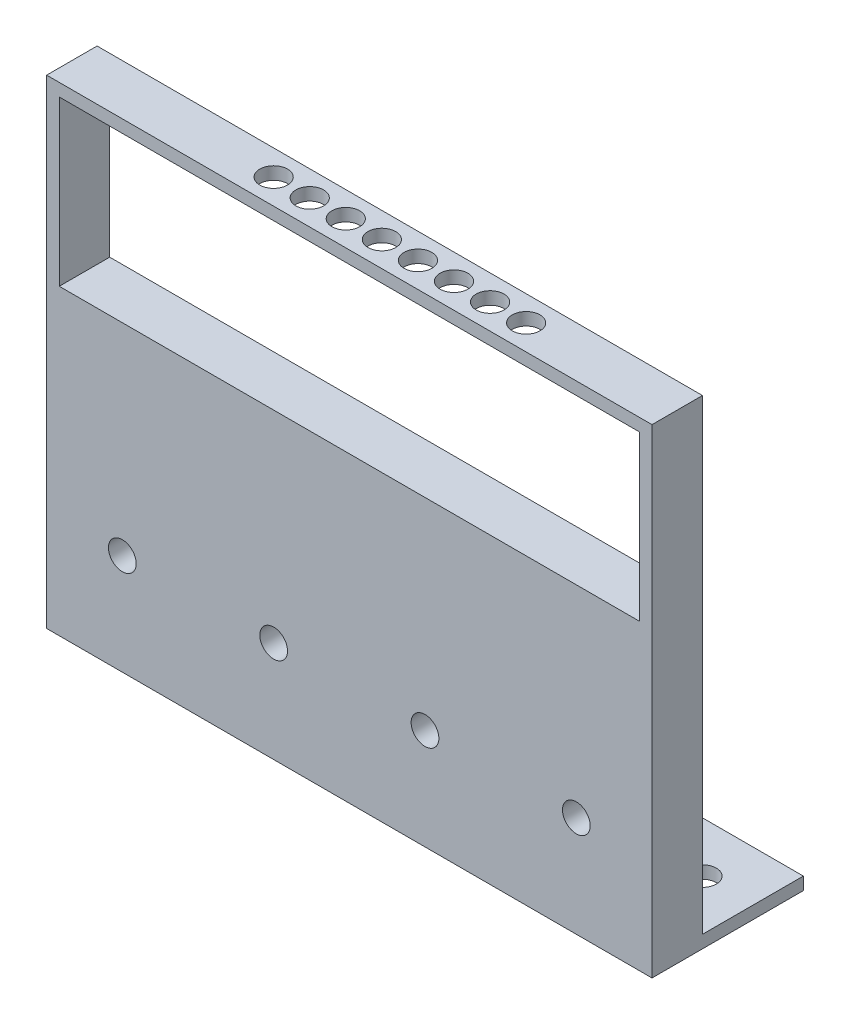
ISO-10303-21;
HEADER;
FILE_DESCRIPTION(('STEP AP214'),'2;1');
FILE_NAME('part.step','',(''),(''),'','','');
FILE_SCHEMA(('AUTOMOTIVE_DESIGN { 1 0 10303 214 1 1 1 1 }'));
ENDSEC;
DATA;
#1=APPLICATION_CONTEXT('core data for automotive mechanical design processes');
#2=APPLICATION_PROTOCOL_DEFINITION('international standard','automotive_design',2000,#1);
#3=PRODUCT_CONTEXT('',#1,'mechanical');
#4=PRODUCT('Part','Part','',(#3));
#5=PRODUCT_RELATED_PRODUCT_CATEGORY('part','',(#4));
#6=PRODUCT_DEFINITION_FORMATION('','',#4);
#7=PRODUCT_DEFINITION_CONTEXT('part definition',#1,'design');
#8=PRODUCT_DEFINITION('design','',#6,#7);
#9=PRODUCT_DEFINITION_SHAPE('','',#8);
#10=(LENGTH_UNIT() NAMED_UNIT(*) SI_UNIT(.MILLI.,.METRE.));
#11=(NAMED_UNIT(*) PLANE_ANGLE_UNIT() SI_UNIT($,.RADIAN.));
#12=(NAMED_UNIT(*) SI_UNIT($,.STERADIAN.) SOLID_ANGLE_UNIT());
#13=UNCERTAINTY_MEASURE_WITH_UNIT(LENGTH_MEASURE(1.E-05),#10,'distance_accuracy_value','');
#14=(GEOMETRIC_REPRESENTATION_CONTEXT(3) GLOBAL_UNCERTAINTY_ASSIGNED_CONTEXT((#13)) GLOBAL_UNIT_ASSIGNED_CONTEXT((#10,
#11,#12)) REPRESENTATION_CONTEXT('',''));
#15=CARTESIAN_POINT('',(0.,0.,0.));
#16=DIRECTION('',(0.,0.,1.));
#17=DIRECTION('',(1.,0.,0.));
#18=AXIS2_PLACEMENT_3D('',#15,#16,#17);
#19=CARTESIAN_POINT('',(-76.2,76.2,-6.35));
#20=DIRECTION('',(0.,0.,1.));
#21=DIRECTION('',(1.,0.,0.));
#22=AXIS2_PLACEMENT_3D('',#19,#20,#21);
#23=PLANE('',#22);
#24=CARTESIAN_POINT('',(-19.05,25.4,-6.35));
#25=DIRECTION('',(0.,0.,1.));
#26=DIRECTION('',(1.,0.,0.));
#27=AXIS2_PLACEMENT_3D('',#24,#25,#26);
#28=CIRCLE('',#27,3.49250000000001);
#29=CARTESIAN_POINT('',(-15.5575,25.4,-6.35));
#30=VERTEX_POINT('',#29);
#31=EDGE_CURVE('E308',#30,#30,#28,.T.);
#32=ORIENTED_EDGE('',*,*,#31,.T.);
#33=EDGE_LOOP('',(#32));
#34=FACE_BOUND('',#33,.T.);
#35=CARTESIAN_POINT('',(19.05,25.4,-6.35));
#36=DIRECTION('',(0.,0.,1.));
#37=DIRECTION('',(1.,0.,0.));
#38=AXIS2_PLACEMENT_3D('',#35,#36,#37);
#39=CIRCLE('',#38,3.49250000000001);
#40=CARTESIAN_POINT('',(22.5425,25.4,-6.35));
#41=VERTEX_POINT('',#40);
#42=EDGE_CURVE('E311',#41,#41,#39,.T.);
#43=ORIENTED_EDGE('',*,*,#42,.T.);
#44=EDGE_LOOP('',(#43));
#45=FACE_BOUND('',#44,.T.);
#46=CARTESIAN_POINT('',(57.15,25.4,-6.35));
#47=DIRECTION('',(0.,0.,1.));
#48=DIRECTION('',(1.,0.,0.));
#49=AXIS2_PLACEMENT_3D('',#46,#47,#48);
#50=CIRCLE('',#49,3.49250000000001);
#51=CARTESIAN_POINT('',(60.6425,25.4,-6.35));
#52=VERTEX_POINT('',#51);
#53=EDGE_CURVE('E314',#52,#52,#50,.T.);
#54=ORIENTED_EDGE('',*,*,#53,.T.);
#55=EDGE_LOOP('',(#54));
#56=FACE_BOUND('',#55,.T.);
#57=CARTESIAN_POINT('',(-57.15,25.4,-6.35));
#58=DIRECTION('',(0.,0.,1.));
#59=DIRECTION('',(1.,0.,0.));
#60=AXIS2_PLACEMENT_3D('',#57,#58,#59);
#61=CIRCLE('',#60,3.49250000000001);
#62=CARTESIAN_POINT('',(-53.6575,25.4,-6.35));
#63=VERTEX_POINT('',#62);
#64=EDGE_CURVE('E265',#63,#63,#61,.T.);
#65=ORIENTED_EDGE('',*,*,#64,.T.);
#66=EDGE_LOOP('',(#65));
#67=FACE_BOUND('',#66,.T.);
#68=DIRECTION('',(-1.,0.,0.));
#69=VECTOR('',#68,1.);
#70=CARTESIAN_POINT('',(-76.2,76.2,-6.35));
#71=LINE('',#70,#69);
#72=CARTESIAN_POINT('',(73.025,76.2,-6.34999999999999));
#73=VERTEX_POINT('',#72);
#74=CARTESIAN_POINT('',(-73.025,76.2,-6.35));
#75=VERTEX_POINT('',#74);
#76=EDGE_CURVE('E212',#73,#75,#71,.T.);
#77=ORIENTED_EDGE('',*,*,#76,.F.);
#78=DIRECTION('',(0.,1.,0.));
#79=VECTOR('',#78,1.);
#80=CARTESIAN_POINT('',(73.025,76.2,-6.34999999999999));
#81=LINE('',#80,#79);
#82=CARTESIAN_POINT('',(73.025,117.475,-6.34999999999999));
#83=VERTEX_POINT('',#82);
#84=EDGE_CURVE('E253',#73,#83,#81,.T.);
#85=ORIENTED_EDGE('',*,*,#84,.T.);
#86=DIRECTION('',(-1.,0.,0.));
#87=VECTOR('',#86,1.);
#88=CARTESIAN_POINT('',(73.025,117.475,-6.34999999999999));
#89=LINE('',#88,#87);
#90=CARTESIAN_POINT('',(-73.025,117.475,-6.34999999999999));
#91=VERTEX_POINT('',#90);
#92=EDGE_CURVE('E147',#83,#91,#89,.T.);
#93=ORIENTED_EDGE('',*,*,#92,.T.);
#94=DIRECTION('',(0.,-1.,0.));
#95=VECTOR('',#94,1.);
#96=CARTESIAN_POINT('',(-73.025,117.475,-6.34999999999999));
#97=LINE('',#96,#95);
#98=EDGE_CURVE('E115',#91,#75,#97,.T.);
#99=ORIENTED_EDGE('',*,*,#98,.T.);
#100=EDGE_LOOP('',(#77,#85,#93,#99));
#101=FACE_BOUND('',#100,.T.);
#102=DIRECTION('',(1.,0.,0.));
#103=VECTOR('',#102,1.);
#104=CARTESIAN_POINT('',(-76.2,3.175,-6.35));
#105=LINE('',#104,#103);
#106=CARTESIAN_POINT('',(-76.2,3.17500000000003,-6.35));
#107=VERTEX_POINT('',#106);
#108=CARTESIAN_POINT('',(76.2,3.175,-6.35));
#109=VERTEX_POINT('',#108);
#110=EDGE_CURVE('E196',#107,#109,#105,.T.);
#111=ORIENTED_EDGE('',*,*,#110,.F.);
#112=DIRECTION('',(0.,-1.,0.));
#113=VECTOR('',#112,1.);
#114=CARTESIAN_POINT('',(-76.2,76.2,-6.35));
#115=LINE('',#114,#113);
#116=CARTESIAN_POINT('',(-76.2,120.65,-6.34999999999999));
#117=VERTEX_POINT('',#116);
#118=EDGE_CURVE('E41',#117,#107,#115,.T.);
#119=ORIENTED_EDGE('',*,*,#118,.F.);
#120=DIRECTION('',(1.,0.,0.));
#121=VECTOR('',#120,1.);
#122=CARTESIAN_POINT('',(-76.2,120.65,-6.34999999999999));
#123=LINE('',#122,#121);
#124=CARTESIAN_POINT('',(76.2,120.65,-6.34999999999999));
#125=VERTEX_POINT('',#124);
#126=EDGE_CURVE('E137',#117,#125,#123,.T.);
#127=ORIENTED_EDGE('',*,*,#126,.T.);
#128=DIRECTION('',(0.,-1.,0.));
#129=VECTOR('',#128,1.);
#130=CARTESIAN_POINT('',(76.2,76.2,-6.35));
#131=LINE('',#130,#129);
#132=EDGE_CURVE('E11',#125,#109,#131,.T.);
#133=ORIENTED_EDGE('',*,*,#132,.T.);
#134=EDGE_LOOP('',(#111,#119,#127,#133));
#135=FACE_BOUND('',#134,.T.);
#136=ADVANCED_FACE('F33',(#34,#45,#56,#67,#101,#135),#23,.F.);
#137=CARTESIAN_POINT('',(76.2,76.2,6.35));
#138=DIRECTION('',(-1.,0.,0.));
#139=DIRECTION('',(0.,0.,1.));
#140=AXIS2_PLACEMENT_3D('',#137,#138,#139);
#141=PLANE('',#140);
#142=DIRECTION('',(0.,0.,-1.));
#143=VECTOR('',#142,1.);
#144=CARTESIAN_POINT('',(76.2,0.,6.35));
#145=LINE('',#144,#143);
#146=CARTESIAN_POINT('',(76.2,0.,6.35));
#147=VERTEX_POINT('',#146);
#148=CARTESIAN_POINT('',(76.2,0.,-31.75));
#149=VERTEX_POINT('',#148);
#150=EDGE_CURVE('E211',#147,#149,#145,.T.);
#151=ORIENTED_EDGE('',*,*,#150,.T.);
#152=DIRECTION('',(0.,-1.,0.));
#153=VECTOR('',#152,1.);
#154=CARTESIAN_POINT('',(76.2,3.175,-31.75));
#155=LINE('',#154,#153);
#156=CARTESIAN_POINT('',(76.2,3.175,-31.75));
#157=VERTEX_POINT('',#156);
#158=EDGE_CURVE('E208',#157,#149,#155,.T.);
#159=ORIENTED_EDGE('',*,*,#158,.F.);
#160=DIRECTION('',(0.,0.,-1.));
#161=VECTOR('',#160,1.);
#162=CARTESIAN_POINT('',(76.2,3.175,-6.35));
#163=LINE('',#162,#161);
#164=EDGE_CURVE('E199',#109,#157,#163,.T.);
#165=ORIENTED_EDGE('',*,*,#164,.F.);
#166=ORIENTED_EDGE('',*,*,#132,.F.);
#167=DIRECTION('',(0.,0.,1.));
#168=VECTOR('',#167,1.);
#169=CARTESIAN_POINT('',(76.2,120.65,-165.1));
#170=LINE('',#169,#168);
#171=CARTESIAN_POINT('',(76.2,120.65,6.35));
#172=VERTEX_POINT('',#171);
#173=EDGE_CURVE('E148',#125,#172,#170,.T.);
#174=ORIENTED_EDGE('',*,*,#173,.T.);
#175=DIRECTION('',(0.,-1.,0.));
#176=VECTOR('',#175,1.);
#177=CARTESIAN_POINT('',(76.2,76.2,6.35));
#178=LINE('',#177,#176);
#179=EDGE_CURVE('E216',#172,#147,#178,.T.);
#180=ORIENTED_EDGE('',*,*,#179,.T.);
#181=EDGE_LOOP('',(#151,#159,#165,#166,#174,#180));
#182=FACE_BOUND('',#181,.T.);
#183=ADVANCED_FACE('F35',(#182),#141,.F.);
#184=CARTESIAN_POINT('',(-76.2,76.2,6.35));
#185=DIRECTION('',(1.,0.,0.));
#186=DIRECTION('',(0.,0.,-1.));
#187=AXIS2_PLACEMENT_3D('',#184,#185,#186);
#188=PLANE('',#187);
#189=DIRECTION('',(0.,0.,1.));
#190=VECTOR('',#189,1.);
#191=CARTESIAN_POINT('',(-76.2,0.,6.35));
#192=LINE('',#191,#190);
#193=CARTESIAN_POINT('',(-76.2,0.,-31.75));
#194=VERTEX_POINT('',#193);
#195=CARTESIAN_POINT('',(-76.2,0.,6.35));
#196=VERTEX_POINT('',#195);
#197=EDGE_CURVE('E218',#194,#196,#192,.T.);
#198=ORIENTED_EDGE('',*,*,#197,.T.);
#199=DIRECTION('',(0.,-1.,0.));
#200=VECTOR('',#199,1.);
#201=CARTESIAN_POINT('',(-76.2,76.2,6.35));
#202=LINE('',#201,#200);
#203=CARTESIAN_POINT('',(-76.2,120.65,6.35));
#204=VERTEX_POINT('',#203);
#205=EDGE_CURVE('E223',#204,#196,#202,.T.);
#206=ORIENTED_EDGE('',*,*,#205,.F.);
#207=DIRECTION('',(0.,0.,1.));
#208=VECTOR('',#207,1.);
#209=CARTESIAN_POINT('',(-76.2,120.65,-165.1));
#210=LINE('',#209,#208);
#211=EDGE_CURVE('E144',#117,#204,#210,.T.);
#212=ORIENTED_EDGE('',*,*,#211,.F.);
#213=ORIENTED_EDGE('',*,*,#118,.T.);
#214=DIRECTION('',(0.,0.,1.));
#215=VECTOR('',#214,1.);
#216=CARTESIAN_POINT('',(-76.2,3.175,-19.05));
#217=LINE('',#216,#215);
#218=CARTESIAN_POINT('',(-76.2,3.175,-31.75));
#219=VERTEX_POINT('',#218);
#220=EDGE_CURVE('E193',#219,#107,#217,.T.);
#221=ORIENTED_EDGE('',*,*,#220,.F.);
#222=DIRECTION('',(0.,-1.,0.));
#223=VECTOR('',#222,1.);
#224=CARTESIAN_POINT('',(-76.2,3.175,-31.75));
#225=LINE('',#224,#223);
#226=EDGE_CURVE('E203',#219,#194,#225,.T.);
#227=ORIENTED_EDGE('',*,*,#226,.T.);
#228=EDGE_LOOP('',(#198,#206,#212,#213,#221,#227));
#229=FACE_BOUND('',#228,.T.);
#230=ADVANCED_FACE('F229',(#229),#188,.F.);
#231=CARTESIAN_POINT('',(-76.2,76.2,6.35));
#232=DIRECTION('',(0.,0.,-1.));
#233=DIRECTION('',(-1.,0.,0.));
#234=AXIS2_PLACEMENT_3D('',#231,#232,#233);
#235=PLANE('',#234);
#236=CARTESIAN_POINT('',(-19.05,25.4,6.35));
#237=DIRECTION('',(0.,0.,1.));
#238=DIRECTION('',(1.,0.,0.));
#239=AXIS2_PLACEMENT_3D('',#236,#237,#238);
#240=CIRCLE('',#239,3.49250000000001);
#241=CARTESIAN_POINT('',(-15.5575,25.4,6.35));
#242=VERTEX_POINT('',#241);
#243=EDGE_CURVE('E317',#242,#242,#240,.T.);
#244=ORIENTED_EDGE('',*,*,#243,.F.);
#245=EDGE_LOOP('',(#244));
#246=FACE_BOUND('',#245,.T.);
#247=CARTESIAN_POINT('',(19.05,25.4,6.35));
#248=DIRECTION('',(0.,0.,1.));
#249=DIRECTION('',(1.,0.,0.));
#250=AXIS2_PLACEMENT_3D('',#247,#248,#249);
#251=CIRCLE('',#250,3.49250000000001);
#252=CARTESIAN_POINT('',(22.5425,25.4,6.35));
#253=VERTEX_POINT('',#252);
#254=EDGE_CURVE('E321',#253,#253,#251,.T.);
#255=ORIENTED_EDGE('',*,*,#254,.F.);
#256=EDGE_LOOP('',(#255));
#257=FACE_BOUND('',#256,.T.);
#258=CARTESIAN_POINT('',(57.15,25.4,6.35));
#259=DIRECTION('',(0.,0.,1.));
#260=DIRECTION('',(1.,0.,0.));
#261=AXIS2_PLACEMENT_3D('',#258,#259,#260);
#262=CIRCLE('',#261,3.49250000000001);
#263=CARTESIAN_POINT('',(60.6425,25.4,6.35));
#264=VERTEX_POINT('',#263);
#265=EDGE_CURVE('E318',#264,#264,#262,.T.);
#266=ORIENTED_EDGE('',*,*,#265,.F.);
#267=EDGE_LOOP('',(#266));
#268=FACE_BOUND('',#267,.T.);
#269=CARTESIAN_POINT('',(-57.15,25.4,6.35));
#270=DIRECTION('',(0.,0.,1.));
#271=DIRECTION('',(1.,0.,0.));
#272=AXIS2_PLACEMENT_3D('',#269,#270,#271);
#273=CIRCLE('',#272,3.49250000000001);
#274=CARTESIAN_POINT('',(-53.6575,25.4,6.35));
#275=VERTEX_POINT('',#274);
#276=EDGE_CURVE('E305',#275,#275,#273,.T.);
#277=ORIENTED_EDGE('',*,*,#276,.F.);
#278=EDGE_LOOP('',(#277));
#279=FACE_BOUND('',#278,.T.);
#280=DIRECTION('',(1.,0.,0.));
#281=VECTOR('',#280,1.);
#282=CARTESIAN_POINT('',(-76.2,76.2,6.35));
#283=LINE('',#282,#281);
#284=CARTESIAN_POINT('',(-73.025,76.2,6.35));
#285=VERTEX_POINT('',#284);
#286=CARTESIAN_POINT('',(73.025,76.2,6.35));
#287=VERTEX_POINT('',#286);
#288=EDGE_CURVE('E48',#285,#287,#283,.T.);
#289=ORIENTED_EDGE('',*,*,#288,.F.);
#290=DIRECTION('',(0.,1.,0.));
#291=VECTOR('',#290,1.);
#292=CARTESIAN_POINT('',(-73.025,117.475,6.35));
#293=LINE('',#292,#291);
#294=CARTESIAN_POINT('',(-73.025,117.475,6.35));
#295=VERTEX_POINT('',#294);
#296=EDGE_CURVE('E113',#285,#295,#293,.T.);
#297=ORIENTED_EDGE('',*,*,#296,.T.);
#298=DIRECTION('',(1.,0.,0.));
#299=VECTOR('',#298,1.);
#300=CARTESIAN_POINT('',(73.025,117.475,6.35));
#301=LINE('',#300,#299);
#302=CARTESIAN_POINT('',(73.025,117.475,6.35));
#303=VERTEX_POINT('',#302);
#304=EDGE_CURVE('E121',#295,#303,#301,.T.);
#305=ORIENTED_EDGE('',*,*,#304,.T.);
#306=DIRECTION('',(0.,-1.,0.));
#307=VECTOR('',#306,1.);
#308=CARTESIAN_POINT('',(73.025,76.2,6.35));
#309=LINE('',#308,#307);
#310=EDGE_CURVE('E127',#303,#287,#309,.T.);
#311=ORIENTED_EDGE('',*,*,#310,.T.);
#312=EDGE_LOOP('',(#289,#297,#305,#311));
#313=FACE_BOUND('',#312,.T.);
#314=DIRECTION('',(1.,0.,0.));
#315=VECTOR('',#314,1.);
#316=CARTESIAN_POINT('',(-76.2,0.,6.35));
#317=LINE('',#316,#315);
#318=EDGE_CURVE('E214',#196,#147,#317,.T.);
#319=ORIENTED_EDGE('',*,*,#318,.T.);
#320=ORIENTED_EDGE('',*,*,#179,.F.);
#321=DIRECTION('',(-1.,0.,0.));
#322=VECTOR('',#321,1.);
#323=CARTESIAN_POINT('',(-76.2,120.65,6.35));
#324=LINE('',#323,#322);
#325=EDGE_CURVE('E141',#172,#204,#324,.T.);
#326=ORIENTED_EDGE('',*,*,#325,.T.);
#327=ORIENTED_EDGE('',*,*,#205,.T.);
#328=EDGE_LOOP('',(#319,#320,#326,#327));
#329=FACE_BOUND('',#328,.T.);
#330=ADVANCED_FACE('F129',(#246,#257,#268,#279,#313,#329),#235,.F.);
#331=CARTESIAN_POINT('',(0.,76.2,0.));
#332=DIRECTION('',(0.,-1.,0.));
#333=DIRECTION('',(0.,0.,-1.));
#334=AXIS2_PLACEMENT_3D('',#331,#332,#333);
#335=PLANE('',#334);
#336=ORIENTED_EDGE('',*,*,#288,.T.);
#337=DIRECTION('',(0.,0.,1.));
#338=VECTOR('',#337,1.);
#339=CARTESIAN_POINT('',(73.025,76.2,-165.1));
#340=LINE('',#339,#338);
#341=EDGE_CURVE('E151',#73,#287,#340,.T.);
#342=ORIENTED_EDGE('',*,*,#341,.F.);
#343=ORIENTED_EDGE('',*,*,#76,.T.);
#344=DIRECTION('',(0.,0.,1.));
#345=VECTOR('',#344,1.);
#346=CARTESIAN_POINT('',(-73.025,76.2,-165.1));
#347=LINE('',#346,#345);
#348=EDGE_CURVE('E53',#75,#285,#347,.T.);
#349=ORIENTED_EDGE('',*,*,#348,.T.);
#350=EDGE_LOOP('',(#336,#342,#343,#349));
#351=FACE_BOUND('',#350,.T.);
#352=ADVANCED_FACE('F332',(#351),#335,.F.);
#353=CARTESIAN_POINT('',(0.,0.,0.));
#354=DIRECTION('',(0.,-1.,0.));
#355=DIRECTION('',(0.,0.,-1.));
#356=AXIS2_PLACEMENT_3D('',#353,#354,#355);
#357=PLANE('',#356);
#358=ORIENTED_EDGE('',*,*,#150,.F.);
#359=ORIENTED_EDGE('',*,*,#318,.F.);
#360=ORIENTED_EDGE('',*,*,#197,.F.);
#361=DIRECTION('',(-1.,0.,0.));
#362=VECTOR('',#361,1.);
#363=CARTESIAN_POINT('',(76.2,0.,-31.75));
#364=LINE('',#363,#362);
#365=EDGE_CURVE('E190',#149,#194,#364,.T.);
#366=ORIENTED_EDGE('',*,*,#365,.F.);
#367=EDGE_LOOP('',(#358,#359,#360,#366));
#368=FACE_BOUND('',#367,.T.);
#369=CARTESIAN_POINT('',(-63.5,0.,-19.05));
#370=DIRECTION('',(0.,1.,0.));
#371=DIRECTION('',(0.,0.,1.));
#372=AXIS2_PLACEMENT_3D('',#369,#370,#371);
#373=CIRCLE('',#372,3.49250000000001);
#374=CARTESIAN_POINT('',(-63.5,0.,-15.5575));
#375=VERTEX_POINT('',#374);
#376=EDGE_CURVE('E184',#375,#375,#373,.T.);
#377=ORIENTED_EDGE('',*,*,#376,.T.);
#378=EDGE_LOOP('',(#377));
#379=FACE_BOUND('',#378,.T.);
#380=CARTESIAN_POINT('',(-38.1,0.,-19.05));
#381=DIRECTION('',(0.,1.,0.));
#382=DIRECTION('',(0.,0.,1.));
#383=AXIS2_PLACEMENT_3D('',#380,#381,#382);
#384=CIRCLE('',#383,3.49250000000001);
#385=CARTESIAN_POINT('',(-38.1,0.,-15.5575));
#386=VERTEX_POINT('',#385);
#387=EDGE_CURVE('E178',#386,#386,#384,.T.);
#388=ORIENTED_EDGE('',*,*,#387,.T.);
#389=EDGE_LOOP('',(#388));
#390=FACE_BOUND('',#389,.T.);
#391=CARTESIAN_POINT('',(-12.7,0.,-19.05));
#392=DIRECTION('',(0.,1.,0.));
#393=DIRECTION('',(0.,0.,1.));
#394=AXIS2_PLACEMENT_3D('',#391,#392,#393);
#395=CIRCLE('',#394,3.4925);
#396=CARTESIAN_POINT('',(-12.7,0.,-15.5575));
#397=VERTEX_POINT('',#396);
#398=EDGE_CURVE('E172',#397,#397,#395,.T.);
#399=ORIENTED_EDGE('',*,*,#398,.T.);
#400=EDGE_LOOP('',(#399));
#401=FACE_BOUND('',#400,.T.);
#402=CARTESIAN_POINT('',(12.7,0.,-19.05));
#403=DIRECTION('',(0.,1.,0.));
#404=DIRECTION('',(0.,0.,1.));
#405=AXIS2_PLACEMENT_3D('',#402,#403,#404);
#406=CIRCLE('',#405,3.4925);
#407=CARTESIAN_POINT('',(12.7,0.,-15.5575));
#408=VERTEX_POINT('',#407);
#409=EDGE_CURVE('E166',#408,#408,#406,.T.);
#410=ORIENTED_EDGE('',*,*,#409,.T.);
#411=EDGE_LOOP('',(#410));
#412=FACE_BOUND('',#411,.T.);
#413=CARTESIAN_POINT('',(38.1,0.,-19.05));
#414=DIRECTION('',(0.,1.,0.));
#415=DIRECTION('',(0.,0.,1.));
#416=AXIS2_PLACEMENT_3D('',#413,#414,#415);
#417=CIRCLE('',#416,3.49250000000001);
#418=CARTESIAN_POINT('',(38.1,0.,-15.5575));
#419=VERTEX_POINT('',#418);
#420=EDGE_CURVE('E160',#419,#419,#417,.T.);
#421=ORIENTED_EDGE('',*,*,#420,.T.);
#422=EDGE_LOOP('',(#421));
#423=FACE_BOUND('',#422,.T.);
#424=CARTESIAN_POINT('',(63.4999999999999,0.,-19.05));
#425=DIRECTION('',(0.,1.,0.));
#426=DIRECTION('',(0.,0.,1.));
#427=AXIS2_PLACEMENT_3D('',#424,#425,#426);
#428=CIRCLE('',#427,3.49249999999999);
#429=CARTESIAN_POINT('',(63.4999999999999,0.,-15.5575));
#430=VERTEX_POINT('',#429);
#431=EDGE_CURVE('E156',#430,#430,#428,.T.);
#432=ORIENTED_EDGE('',*,*,#431,.T.);
#433=EDGE_LOOP('',(#432));
#434=FACE_BOUND('',#433,.T.);
#435=ADVANCED_FACE('F247',(#368,#379,#390,#401,#412,#423,#434),#357,.T.);
#436=CARTESIAN_POINT('',(0.,3.175,0.));
#437=DIRECTION('',(0.,1.,0.));
#438=DIRECTION('',(0.,0.,1.));
#439=AXIS2_PLACEMENT_3D('',#436,#437,#438);
#440=PLANE('',#439);
#441=CARTESIAN_POINT('',(38.1,3.175,-19.05));
#442=DIRECTION('',(0.,1.,0.));
#443=DIRECTION('',(0.,0.,1.));
#444=AXIS2_PLACEMENT_3D('',#441,#442,#443);
#445=CIRCLE('',#444,3.49250000000001);
#446=CARTESIAN_POINT('',(38.1,3.175,-15.5575));
#447=VERTEX_POINT('',#446);
#448=EDGE_CURVE('E163',#447,#447,#445,.T.);
#449=ORIENTED_EDGE('',*,*,#448,.F.);
#450=EDGE_LOOP('',(#449));
#451=FACE_BOUND('',#450,.T.);
#452=CARTESIAN_POINT('',(-12.7,3.175,-19.05));
#453=DIRECTION('',(0.,1.,0.));
#454=DIRECTION('',(0.,0.,1.));
#455=AXIS2_PLACEMENT_3D('',#452,#453,#454);
#456=CIRCLE('',#455,3.4925);
#457=CARTESIAN_POINT('',(-12.7,3.175,-15.5575));
#458=VERTEX_POINT('',#457);
#459=EDGE_CURVE('E175',#458,#458,#456,.T.);
#460=ORIENTED_EDGE('',*,*,#459,.F.);
#461=EDGE_LOOP('',(#460));
#462=FACE_BOUND('',#461,.T.);
#463=CARTESIAN_POINT('',(-63.5,3.175,-19.05));
#464=DIRECTION('',(0.,1.,0.));
#465=DIRECTION('',(0.,0.,1.));
#466=AXIS2_PLACEMENT_3D('',#463,#464,#465);
#467=CIRCLE('',#466,3.49250000000001);
#468=CARTESIAN_POINT('',(-63.5,3.175,-15.5575));
#469=VERTEX_POINT('',#468);
#470=EDGE_CURVE('E187',#469,#469,#467,.T.);
#471=ORIENTED_EDGE('',*,*,#470,.F.);
#472=EDGE_LOOP('',(#471));
#473=FACE_BOUND('',#472,.T.);
#474=ORIENTED_EDGE('',*,*,#220,.T.);
#475=ORIENTED_EDGE('',*,*,#110,.T.);
#476=ORIENTED_EDGE('',*,*,#164,.T.);
#477=DIRECTION('',(-1.,0.,0.));
#478=VECTOR('',#477,1.);
#479=CARTESIAN_POINT('',(76.2,3.175,-31.75));
#480=LINE('',#479,#478);
#481=EDGE_CURVE('E201',#157,#219,#480,.T.);
#482=ORIENTED_EDGE('',*,*,#481,.T.);
#483=EDGE_LOOP('',(#474,#475,#476,#482));
#484=FACE_BOUND('',#483,.T.);
#485=CARTESIAN_POINT('',(-38.1,3.175,-19.05));
#486=DIRECTION('',(0.,1.,0.));
#487=DIRECTION('',(0.,0.,1.));
#488=AXIS2_PLACEMENT_3D('',#485,#486,#487);
#489=CIRCLE('',#488,3.49250000000001);
#490=CARTESIAN_POINT('',(-38.1,3.175,-15.5575));
#491=VERTEX_POINT('',#490);
#492=EDGE_CURVE('E181',#491,#491,#489,.T.);
#493=ORIENTED_EDGE('',*,*,#492,.F.);
#494=EDGE_LOOP('',(#493));
#495=FACE_BOUND('',#494,.T.);
#496=CARTESIAN_POINT('',(12.7,3.175,-19.05));
#497=DIRECTION('',(0.,1.,0.));
#498=DIRECTION('',(0.,0.,1.));
#499=AXIS2_PLACEMENT_3D('',#496,#497,#498);
#500=CIRCLE('',#499,3.4925);
#501=CARTESIAN_POINT('',(12.7,3.175,-15.5575));
#502=VERTEX_POINT('',#501);
#503=EDGE_CURVE('E169',#502,#502,#500,.T.);
#504=ORIENTED_EDGE('',*,*,#503,.F.);
#505=EDGE_LOOP('',(#504));
#506=FACE_BOUND('',#505,.T.);
#507=CARTESIAN_POINT('',(63.4999999999999,3.175,-19.05));
#508=DIRECTION('',(0.,1.,0.));
#509=DIRECTION('',(0.,0.,1.));
#510=AXIS2_PLACEMENT_3D('',#507,#508,#509);
#511=CIRCLE('',#510,3.49249999999999);
#512=CARTESIAN_POINT('',(63.4999999999999,3.175,-15.5575));
#513=VERTEX_POINT('',#512);
#514=EDGE_CURVE('E157',#513,#513,#511,.T.);
#515=ORIENTED_EDGE('',*,*,#514,.F.);
#516=EDGE_LOOP('',(#515));
#517=FACE_BOUND('',#516,.T.);
#518=ADVANCED_FACE('F234',(#451,#462,#473,#484,#495,#506,#517),#440,.T.);
#519=CARTESIAN_POINT('',(76.2,3.175,-31.75));
#520=DIRECTION('',(0.,0.,1.));
#521=DIRECTION('',(1.,0.,0.));
#522=AXIS2_PLACEMENT_3D('',#519,#520,#521);
#523=PLANE('',#522);
#524=ORIENTED_EDGE('',*,*,#365,.T.);
#525=ORIENTED_EDGE('',*,*,#226,.F.);
#526=ORIENTED_EDGE('',*,*,#481,.F.);
#527=ORIENTED_EDGE('',*,*,#158,.T.);
#528=EDGE_LOOP('',(#524,#525,#526,#527));
#529=FACE_BOUND('',#528,.T.);
#530=ADVANCED_FACE('F241',(#529),#523,.F.);
#531=CARTESIAN_POINT('',(-63.5,3.175,-19.05));
#532=DIRECTION('',(0.,-1.,0.));
#533=DIRECTION('',(0.,0.,-1.));
#534=AXIS2_PLACEMENT_3D('',#531,#532,#533);
#535=CYLINDRICAL_SURFACE('',#534,3.49250000000001);
#536=ORIENTED_EDGE('',*,*,#470,.T.);
#537=EDGE_LOOP('',(#536));
#538=FACE_BOUND('',#537,.T.);
#539=ORIENTED_EDGE('',*,*,#376,.F.);
#540=EDGE_LOOP('',(#539));
#541=FACE_BOUND('',#540,.T.);
#542=ADVANCED_FACE('F386',(#538,#541),#535,.F.);
#543=CARTESIAN_POINT('',(-38.1,3.175,-19.05));
#544=DIRECTION('',(0.,-1.,0.));
#545=DIRECTION('',(0.,0.,-1.));
#546=AXIS2_PLACEMENT_3D('',#543,#544,#545);
#547=CYLINDRICAL_SURFACE('',#546,3.49250000000001);
#548=ORIENTED_EDGE('',*,*,#492,.T.);
#549=EDGE_LOOP('',(#548));
#550=FACE_BOUND('',#549,.T.);
#551=ORIENTED_EDGE('',*,*,#387,.F.);
#552=EDGE_LOOP('',(#551));
#553=FACE_BOUND('',#552,.T.);
#554=ADVANCED_FACE('F382',(#550,#553),#547,.F.);
#555=CARTESIAN_POINT('',(-12.7,3.175,-19.05));
#556=DIRECTION('',(0.,-1.,0.));
#557=DIRECTION('',(0.,0.,-1.));
#558=AXIS2_PLACEMENT_3D('',#555,#556,#557);
#559=CYLINDRICAL_SURFACE('',#558,3.4925);
#560=ORIENTED_EDGE('',*,*,#459,.T.);
#561=EDGE_LOOP('',(#560));
#562=FACE_BOUND('',#561,.T.);
#563=ORIENTED_EDGE('',*,*,#398,.F.);
#564=EDGE_LOOP('',(#563));
#565=FACE_BOUND('',#564,.T.);
#566=ADVANCED_FACE('F378',(#562,#565),#559,.F.);
#567=CARTESIAN_POINT('',(12.7,3.175,-19.05));
#568=DIRECTION('',(0.,-1.,0.));
#569=DIRECTION('',(0.,0.,-1.));
#570=AXIS2_PLACEMENT_3D('',#567,#568,#569);
#571=CYLINDRICAL_SURFACE('',#570,3.4925);
#572=ORIENTED_EDGE('',*,*,#503,.T.);
#573=EDGE_LOOP('',(#572));
#574=FACE_BOUND('',#573,.T.);
#575=ORIENTED_EDGE('',*,*,#409,.F.);
#576=EDGE_LOOP('',(#575));
#577=FACE_BOUND('',#576,.T.);
#578=ADVANCED_FACE('F374',(#574,#577),#571,.F.);
#579=CARTESIAN_POINT('',(38.1,3.175,-19.05));
#580=DIRECTION('',(0.,-1.,0.));
#581=DIRECTION('',(0.,0.,-1.));
#582=AXIS2_PLACEMENT_3D('',#579,#580,#581);
#583=CYLINDRICAL_SURFACE('',#582,3.49250000000001);
#584=ORIENTED_EDGE('',*,*,#448,.T.);
#585=EDGE_LOOP('',(#584));
#586=FACE_BOUND('',#585,.T.);
#587=ORIENTED_EDGE('',*,*,#420,.F.);
#588=EDGE_LOOP('',(#587));
#589=FACE_BOUND('',#588,.T.);
#590=ADVANCED_FACE('F370',(#586,#589),#583,.F.);
#591=CARTESIAN_POINT('',(63.4999999999999,3.175,-19.05));
#592=DIRECTION('',(0.,-1.,0.));
#593=DIRECTION('',(0.,0.,-1.));
#594=AXIS2_PLACEMENT_3D('',#591,#592,#593);
#595=CYLINDRICAL_SURFACE('',#594,3.49249999999999);
#596=ORIENTED_EDGE('',*,*,#514,.T.);
#597=EDGE_LOOP('',(#596));
#598=FACE_BOUND('',#597,.T.);
#599=ORIENTED_EDGE('',*,*,#431,.F.);
#600=EDGE_LOOP('',(#599));
#601=FACE_BOUND('',#600,.T.);
#602=ADVANCED_FACE('F360',(#598,#601),#595,.F.);
#603=CARTESIAN_POINT('',(-76.2,120.65,-165.1));
#604=DIRECTION('',(0.,1.,0.));
#605=DIRECTION('',(0.,0.,1.));
#606=AXIS2_PLACEMENT_3D('',#603,#604,#605);
#607=PLANE('',#606);
#608=CARTESIAN_POINT('',(-16.3195,120.65,0.));
#609=DIRECTION('',(0.,1.,0.));
#610=DIRECTION('',(0.,0.,1.));
#611=AXIS2_PLACEMENT_3D('',#608,#609,#610);
#612=CIRCLE('',#611,3.4925);
#613=CARTESIAN_POINT('',(-16.3195,120.65,3.4925));
#614=VERTEX_POINT('',#613);
#615=EDGE_CURVE('E259',#614,#614,#612,.T.);
#616=ORIENTED_EDGE('',*,*,#615,.F.);
#617=EDGE_LOOP('',(#616));
#618=FACE_BOUND('',#617,.T.);
#619=CARTESIAN_POINT('',(-7.23900000000002,120.65,0.));
#620=DIRECTION('',(0.,1.,0.));
#621=DIRECTION('',(0.,0.,1.));
#622=AXIS2_PLACEMENT_3D('',#619,#620,#621);
#623=CIRCLE('',#622,3.4925);
#624=CARTESIAN_POINT('',(-7.23900000000002,120.65,3.4925));
#625=VERTEX_POINT('',#624);
#626=EDGE_CURVE('E295',#625,#625,#623,.T.);
#627=ORIENTED_EDGE('',*,*,#626,.F.);
#628=EDGE_LOOP('',(#627));
#629=FACE_BOUND('',#628,.T.);
#630=CARTESIAN_POINT('',(1.84149999999998,120.65,0.));
#631=DIRECTION('',(0.,1.,0.));
#632=DIRECTION('',(0.,0.,1.));
#633=AXIS2_PLACEMENT_3D('',#630,#631,#632);
#634=CIRCLE('',#633,3.4925);
#635=CARTESIAN_POINT('',(1.84149999999998,120.65,3.4925));
#636=VERTEX_POINT('',#635);
#637=EDGE_CURVE('E289',#636,#636,#634,.T.);
#638=ORIENTED_EDGE('',*,*,#637,.F.);
#639=EDGE_LOOP('',(#638));
#640=FACE_BOUND('',#639,.T.);
#641=CARTESIAN_POINT('',(10.922,120.65,0.));
#642=DIRECTION('',(0.,1.,0.));
#643=DIRECTION('',(0.,0.,1.));
#644=AXIS2_PLACEMENT_3D('',#641,#642,#643);
#645=CIRCLE('',#644,3.4925);
#646=CARTESIAN_POINT('',(10.922,120.65,3.4925));
#647=VERTEX_POINT('',#646);
#648=EDGE_CURVE('E283',#647,#647,#645,.T.);
#649=ORIENTED_EDGE('',*,*,#648,.F.);
#650=EDGE_LOOP('',(#649));
#651=FACE_BOUND('',#650,.T.);
#652=CARTESIAN_POINT('',(20.0025,120.65,0.));
#653=DIRECTION('',(0.,1.,0.));
#654=DIRECTION('',(0.,0.,1.));
#655=AXIS2_PLACEMENT_3D('',#652,#653,#654);
#656=CIRCLE('',#655,3.4925);
#657=CARTESIAN_POINT('',(20.0025,120.65,3.4925));
#658=VERTEX_POINT('',#657);
#659=EDGE_CURVE('E277',#658,#658,#656,.T.);
#660=ORIENTED_EDGE('',*,*,#659,.F.);
#661=EDGE_LOOP('',(#660));
#662=FACE_BOUND('',#661,.T.);
#663=CARTESIAN_POINT('',(29.083,120.65,0.));
#664=DIRECTION('',(0.,1.,0.));
#665=DIRECTION('',(0.,0.,1.));
#666=AXIS2_PLACEMENT_3D('',#663,#664,#665);
#667=CIRCLE('',#666,3.49250000000001);
#668=CARTESIAN_POINT('',(29.083,120.65,3.49250000000001));
#669=VERTEX_POINT('',#668);
#670=EDGE_CURVE('E271',#669,#669,#667,.T.);
#671=ORIENTED_EDGE('',*,*,#670,.F.);
#672=EDGE_LOOP('',(#671));
#673=FACE_BOUND('',#672,.T.);
#674=CARTESIAN_POINT('',(38.1635,120.65,0.));
#675=DIRECTION('',(0.,1.,0.));
#676=DIRECTION('',(0.,0.,1.));
#677=AXIS2_PLACEMENT_3D('',#674,#675,#676);
#678=CIRCLE('',#677,3.49250000000001);
#679=CARTESIAN_POINT('',(38.1635,120.65,3.49250000000001));
#680=VERTEX_POINT('',#679);
#681=EDGE_CURVE('E264',#680,#680,#678,.T.);
#682=ORIENTED_EDGE('',*,*,#681,.F.);
#683=EDGE_LOOP('',(#682));
#684=FACE_BOUND('',#683,.T.);
#685=CARTESIAN_POINT('',(-25.4,120.65,0.));
#686=DIRECTION('',(0.,1.,0.));
#687=DIRECTION('',(0.,0.,1.));
#688=AXIS2_PLACEMENT_3D('',#685,#686,#687);
#689=CIRCLE('',#688,3.4925);
#690=CARTESIAN_POINT('',(-25.4,120.65,3.4925));
#691=VERTEX_POINT('',#690);
#692=EDGE_CURVE('E131',#691,#691,#689,.T.);
#693=ORIENTED_EDGE('',*,*,#692,.F.);
#694=EDGE_LOOP('',(#693));
#695=FACE_BOUND('',#694,.T.);
#696=ORIENTED_EDGE('',*,*,#126,.F.);
#697=ORIENTED_EDGE('',*,*,#211,.T.);
#698=ORIENTED_EDGE('',*,*,#325,.F.);
#699=ORIENTED_EDGE('',*,*,#173,.F.);
#700=EDGE_LOOP('',(#696,#697,#698,#699));
#701=FACE_BOUND('',#700,.T.);
#702=ADVANCED_FACE('F252',(#618,#629,#640,#651,#662,#673,#684,#695,#701),#607,.T.);
#703=CARTESIAN_POINT('',(73.025,76.2,-165.1));
#704=DIRECTION('',(-1.,0.,0.));
#705=DIRECTION('',(0.,0.,1.));
#706=AXIS2_PLACEMENT_3D('',#703,#704,#705);
#707=PLANE('',#706);
#708=ORIENTED_EDGE('',*,*,#84,.F.);
#709=ORIENTED_EDGE('',*,*,#341,.T.);
#710=ORIENTED_EDGE('',*,*,#310,.F.);
#711=DIRECTION('',(0.,0.,1.));
#712=VECTOR('',#711,1.);
#713=CARTESIAN_POINT('',(73.025,117.475,-165.1));
#714=LINE('',#713,#712);
#715=EDGE_CURVE('E118',#83,#303,#714,.T.);
#716=ORIENTED_EDGE('',*,*,#715,.F.);
#717=EDGE_LOOP('',(#708,#709,#710,#716));
#718=FACE_BOUND('',#717,.T.);
#719=ADVANCED_FACE('F351',(#718),#707,.T.);
#720=CARTESIAN_POINT('',(73.025,117.475,-165.1));
#721=DIRECTION('',(0.,-1.,0.));
#722=DIRECTION('',(1.,0.,0.));
#723=AXIS2_PLACEMENT_3D('',#720,#721,#722);
#724=PLANE('',#723);
#725=CARTESIAN_POINT('',(-16.3195,117.475,0.));
#726=DIRECTION('',(0.,-1.,0.));
#727=DIRECTION('',(1.,0.,0.));
#728=AXIS2_PLACEMENT_3D('',#725,#726,#727);
#729=CIRCLE('',#728,3.4925);
#730=CARTESIAN_POINT('',(-12.827,117.475,0.));
#731=VERTEX_POINT('',#730);
#732=EDGE_CURVE('E298',#731,#731,#729,.F.);
#733=ORIENTED_EDGE('',*,*,#732,.T.);
#734=EDGE_LOOP('',(#733));
#735=FACE_BOUND('',#734,.T.);
#736=CARTESIAN_POINT('',(-7.23900000000002,117.475,0.));
#737=DIRECTION('',(0.,-1.,0.));
#738=DIRECTION('',(1.,0.,0.));
#739=AXIS2_PLACEMENT_3D('',#736,#737,#738);
#740=CIRCLE('',#739,3.4925);
#741=CARTESIAN_POINT('',(-3.74650000000002,117.475,0.));
#742=VERTEX_POINT('',#741);
#743=EDGE_CURVE('E292',#742,#742,#740,.F.);
#744=ORIENTED_EDGE('',*,*,#743,.T.);
#745=EDGE_LOOP('',(#744));
#746=FACE_BOUND('',#745,.T.);
#747=CARTESIAN_POINT('',(1.84149999999998,117.475,0.));
#748=DIRECTION('',(0.,-1.,0.));
#749=DIRECTION('',(1.,0.,0.));
#750=AXIS2_PLACEMENT_3D('',#747,#748,#749);
#751=CIRCLE('',#750,3.4925);
#752=CARTESIAN_POINT('',(5.33399999999998,117.475,0.));
#753=VERTEX_POINT('',#752);
#754=EDGE_CURVE('E286',#753,#753,#751,.F.);
#755=ORIENTED_EDGE('',*,*,#754,.T.);
#756=EDGE_LOOP('',(#755));
#757=FACE_BOUND('',#756,.T.);
#758=CARTESIAN_POINT('',(10.922,117.475,0.));
#759=DIRECTION('',(0.,-1.,0.));
#760=DIRECTION('',(1.,0.,0.));
#761=AXIS2_PLACEMENT_3D('',#758,#759,#760);
#762=CIRCLE('',#761,3.4925);
#763=CARTESIAN_POINT('',(14.4145,117.475,0.));
#764=VERTEX_POINT('',#763);
#765=EDGE_CURVE('E280',#764,#764,#762,.F.);
#766=ORIENTED_EDGE('',*,*,#765,.T.);
#767=EDGE_LOOP('',(#766));
#768=FACE_BOUND('',#767,.T.);
#769=CARTESIAN_POINT('',(20.0025,117.475,0.));
#770=DIRECTION('',(0.,-1.,0.));
#771=DIRECTION('',(1.,0.,0.));
#772=AXIS2_PLACEMENT_3D('',#769,#770,#771);
#773=CIRCLE('',#772,3.4925);
#774=CARTESIAN_POINT('',(23.495,117.475,0.));
#775=VERTEX_POINT('',#774);
#776=EDGE_CURVE('E274',#775,#775,#773,.F.);
#777=ORIENTED_EDGE('',*,*,#776,.T.);
#778=EDGE_LOOP('',(#777));
#779=FACE_BOUND('',#778,.T.);
#780=CARTESIAN_POINT('',(29.083,117.475,0.));
#781=DIRECTION('',(0.,-1.,0.));
#782=DIRECTION('',(1.,0.,0.));
#783=AXIS2_PLACEMENT_3D('',#780,#781,#782);
#784=CIRCLE('',#783,3.49250000000001);
#785=CARTESIAN_POINT('',(32.5755,117.475,0.));
#786=VERTEX_POINT('',#785);
#787=EDGE_CURVE('E268',#786,#786,#784,.F.);
#788=ORIENTED_EDGE('',*,*,#787,.T.);
#789=EDGE_LOOP('',(#788));
#790=FACE_BOUND('',#789,.T.);
#791=CARTESIAN_POINT('',(38.1635,117.475,0.));
#792=DIRECTION('',(0.,-1.,0.));
#793=DIRECTION('',(1.,0.,0.));
#794=AXIS2_PLACEMENT_3D('',#791,#792,#793);
#795=CIRCLE('',#794,3.49250000000001);
#796=CARTESIAN_POINT('',(41.656,117.475,0.));
#797=VERTEX_POINT('',#796);
#798=EDGE_CURVE('E261',#797,#797,#795,.F.);
#799=ORIENTED_EDGE('',*,*,#798,.T.);
#800=EDGE_LOOP('',(#799));
#801=FACE_BOUND('',#800,.T.);
#802=CARTESIAN_POINT('',(-25.4,117.475,0.));
#803=DIRECTION('',(0.,-1.,0.));
#804=DIRECTION('',(1.,0.,0.));
#805=AXIS2_PLACEMENT_3D('',#802,#803,#804);
#806=CIRCLE('',#805,3.4925);
#807=CARTESIAN_POINT('',(-21.9075,117.475,0.));
#808=VERTEX_POINT('',#807);
#809=EDGE_CURVE('E134',#808,#808,#806,.F.);
#810=ORIENTED_EDGE('',*,*,#809,.T.);
#811=EDGE_LOOP('',(#810));
#812=FACE_BOUND('',#811,.T.);
#813=ORIENTED_EDGE('',*,*,#92,.F.);
#814=ORIENTED_EDGE('',*,*,#715,.T.);
#815=ORIENTED_EDGE('',*,*,#304,.F.);
#816=DIRECTION('',(0.,0.,1.));
#817=VECTOR('',#816,1.);
#818=CARTESIAN_POINT('',(-73.025,117.475,-165.1));
#819=LINE('',#818,#817);
#820=EDGE_CURVE('E109',#91,#295,#819,.T.);
#821=ORIENTED_EDGE('',*,*,#820,.F.);
#822=EDGE_LOOP('',(#813,#814,#815,#821));
#823=FACE_BOUND('',#822,.T.);
#824=ADVANCED_FACE('F122',(#735,#746,#757,#768,#779,#790,#801,#812,#823),#724,.T.);
#825=CARTESIAN_POINT('',(-73.025,117.475,-165.1));
#826=DIRECTION('',(1.,0.,0.));
#827=DIRECTION('',(0.,0.,-1.));
#828=AXIS2_PLACEMENT_3D('',#825,#826,#827);
#829=PLANE('',#828);
#830=ORIENTED_EDGE('',*,*,#98,.F.);
#831=ORIENTED_EDGE('',*,*,#820,.T.);
#832=ORIENTED_EDGE('',*,*,#296,.F.);
#833=ORIENTED_EDGE('',*,*,#348,.F.);
#834=EDGE_LOOP('',(#830,#831,#832,#833));
#835=FACE_BOUND('',#834,.T.);
#836=ADVANCED_FACE('F111',(#835),#829,.T.);
#837=CARTESIAN_POINT('',(-25.4,-0.001000000000001,0.));
#838=DIRECTION('',(0.,1.,0.));
#839=DIRECTION('',(0.,0.,1.));
#840=AXIS2_PLACEMENT_3D('',#837,#838,#839);
#841=CYLINDRICAL_SURFACE('',#840,3.4925);
#842=ORIENTED_EDGE('',*,*,#809,.F.);
#843=EDGE_LOOP('',(#842));
#844=FACE_BOUND('',#843,.T.);
#845=ORIENTED_EDGE('',*,*,#692,.T.);
#846=EDGE_LOOP('',(#845));
#847=FACE_BOUND('',#846,.T.);
#848=ADVANCED_FACE('F367',(#844,#847),#841,.F.);
#849=CARTESIAN_POINT('',(38.1635,-0.001000000000001,0.));
#850=DIRECTION('',(0.,1.,0.));
#851=DIRECTION('',(0.,0.,1.));
#852=AXIS2_PLACEMENT_3D('',#849,#850,#851);
#853=CYLINDRICAL_SURFACE('',#852,3.49250000000001);
#854=ORIENTED_EDGE('',*,*,#798,.F.);
#855=EDGE_LOOP('',(#854));
#856=FACE_BOUND('',#855,.T.);
#857=ORIENTED_EDGE('',*,*,#681,.T.);
#858=EDGE_LOOP('',(#857));
#859=FACE_BOUND('',#858,.T.);
#860=ADVANCED_FACE('F486',(#856,#859),#853,.F.);
#861=CARTESIAN_POINT('',(29.083,-0.001000000000001,0.));
#862=DIRECTION('',(0.,1.,0.));
#863=DIRECTION('',(0.,0.,1.));
#864=AXIS2_PLACEMENT_3D('',#861,#862,#863);
#865=CYLINDRICAL_SURFACE('',#864,3.49250000000001);
#866=ORIENTED_EDGE('',*,*,#787,.F.);
#867=EDGE_LOOP('',(#866));
#868=FACE_BOUND('',#867,.T.);
#869=ORIENTED_EDGE('',*,*,#670,.T.);
#870=EDGE_LOOP('',(#869));
#871=FACE_BOUND('',#870,.T.);
#872=ADVANCED_FACE('F482',(#868,#871),#865,.F.);
#873=CARTESIAN_POINT('',(20.0025,-0.001000000000001,0.));
#874=DIRECTION('',(0.,1.,0.));
#875=DIRECTION('',(0.,0.,1.));
#876=AXIS2_PLACEMENT_3D('',#873,#874,#875);
#877=CYLINDRICAL_SURFACE('',#876,3.4925);
#878=ORIENTED_EDGE('',*,*,#776,.F.);
#879=EDGE_LOOP('',(#878));
#880=FACE_BOUND('',#879,.T.);
#881=ORIENTED_EDGE('',*,*,#659,.T.);
#882=EDGE_LOOP('',(#881));
#883=FACE_BOUND('',#882,.T.);
#884=ADVANCED_FACE('F478',(#880,#883),#877,.F.);
#885=CARTESIAN_POINT('',(10.922,-0.001000000000001,0.));
#886=DIRECTION('',(0.,1.,0.));
#887=DIRECTION('',(0.,0.,1.));
#888=AXIS2_PLACEMENT_3D('',#885,#886,#887);
#889=CYLINDRICAL_SURFACE('',#888,3.4925);
#890=ORIENTED_EDGE('',*,*,#765,.F.);
#891=EDGE_LOOP('',(#890));
#892=FACE_BOUND('',#891,.T.);
#893=ORIENTED_EDGE('',*,*,#648,.T.);
#894=EDGE_LOOP('',(#893));
#895=FACE_BOUND('',#894,.T.);
#896=ADVANCED_FACE('F474',(#892,#895),#889,.F.);
#897=CARTESIAN_POINT('',(1.84149999999998,-0.001000000000001,0.));
#898=DIRECTION('',(0.,1.,0.));
#899=DIRECTION('',(0.,0.,1.));
#900=AXIS2_PLACEMENT_3D('',#897,#898,#899);
#901=CYLINDRICAL_SURFACE('',#900,3.4925);
#902=ORIENTED_EDGE('',*,*,#754,.F.);
#903=EDGE_LOOP('',(#902));
#904=FACE_BOUND('',#903,.T.);
#905=ORIENTED_EDGE('',*,*,#637,.T.);
#906=EDGE_LOOP('',(#905));
#907=FACE_BOUND('',#906,.T.);
#908=ADVANCED_FACE('F470',(#904,#907),#901,.F.);
#909=CARTESIAN_POINT('',(-7.23900000000002,-0.001000000000001,0.));
#910=DIRECTION('',(0.,1.,0.));
#911=DIRECTION('',(0.,0.,1.));
#912=AXIS2_PLACEMENT_3D('',#909,#910,#911);
#913=CYLINDRICAL_SURFACE('',#912,3.4925);
#914=ORIENTED_EDGE('',*,*,#743,.F.);
#915=EDGE_LOOP('',(#914));
#916=FACE_BOUND('',#915,.T.);
#917=ORIENTED_EDGE('',*,*,#626,.T.);
#918=EDGE_LOOP('',(#917));
#919=FACE_BOUND('',#918,.T.);
#920=ADVANCED_FACE('F466',(#916,#919),#913,.F.);
#921=CARTESIAN_POINT('',(-16.3195,-0.001000000000001,0.));
#922=DIRECTION('',(0.,1.,0.));
#923=DIRECTION('',(0.,0.,1.));
#924=AXIS2_PLACEMENT_3D('',#921,#922,#923);
#925=CYLINDRICAL_SURFACE('',#924,3.4925);
#926=ORIENTED_EDGE('',*,*,#732,.F.);
#927=EDGE_LOOP('',(#926));
#928=FACE_BOUND('',#927,.T.);
#929=ORIENTED_EDGE('',*,*,#615,.T.);
#930=EDGE_LOOP('',(#929));
#931=FACE_BOUND('',#930,.T.);
#932=ADVANCED_FACE('F344',(#928,#931),#925,.F.);
#933=CARTESIAN_POINT('',(-57.15,25.4,-31.75));
#934=DIRECTION('',(0.,0.,1.));
#935=DIRECTION('',(1.,0.,0.));
#936=AXIS2_PLACEMENT_3D('',#933,#934,#935);
#937=CYLINDRICAL_SURFACE('',#936,3.49250000000001);
#938=ORIENTED_EDGE('',*,*,#276,.T.);
#939=EDGE_LOOP('',(#938));
#940=FACE_BOUND('',#939,.T.);
#941=ORIENTED_EDGE('',*,*,#64,.F.);
#942=EDGE_LOOP('',(#941));
#943=FACE_BOUND('',#942,.T.);
#944=ADVANCED_FACE('F340',(#940,#943),#937,.F.);
#945=CARTESIAN_POINT('',(57.15,25.4,-31.75));
#946=DIRECTION('',(0.,0.,1.));
#947=DIRECTION('',(1.,0.,0.));
#948=AXIS2_PLACEMENT_3D('',#945,#946,#947);
#949=CYLINDRICAL_SURFACE('',#948,3.49250000000001);
#950=ORIENTED_EDGE('',*,*,#265,.T.);
#951=EDGE_LOOP('',(#950));
#952=FACE_BOUND('',#951,.T.);
#953=ORIENTED_EDGE('',*,*,#53,.F.);
#954=EDGE_LOOP('',(#953));
#955=FACE_BOUND('',#954,.T.);
#956=ADVANCED_FACE('F343',(#952,#955),#949,.F.);
#957=CARTESIAN_POINT('',(19.05,25.4,-31.75));
#958=DIRECTION('',(0.,0.,1.));
#959=DIRECTION('',(1.,0.,0.));
#960=AXIS2_PLACEMENT_3D('',#957,#958,#959);
#961=CYLINDRICAL_SURFACE('',#960,3.49250000000001);
#962=ORIENTED_EDGE('',*,*,#254,.T.);
#963=EDGE_LOOP('',(#962));
#964=FACE_BOUND('',#963,.T.);
#965=ORIENTED_EDGE('',*,*,#42,.F.);
#966=EDGE_LOOP('',(#965));
#967=FACE_BOUND('',#966,.T.);
#968=ADVANCED_FACE('F442',(#964,#967),#961,.F.);
#969=CARTESIAN_POINT('',(-19.05,25.4,-31.75));
#970=DIRECTION('',(0.,0.,1.));
#971=DIRECTION('',(1.,0.,0.));
#972=AXIS2_PLACEMENT_3D('',#969,#970,#971);
#973=CYLINDRICAL_SURFACE('',#972,3.49250000000001);
#974=ORIENTED_EDGE('',*,*,#243,.T.);
#975=EDGE_LOOP('',(#974));
#976=FACE_BOUND('',#975,.T.);
#977=ORIENTED_EDGE('',*,*,#31,.F.);
#978=EDGE_LOOP('',(#977));
#979=FACE_BOUND('',#978,.T.);
#980=ADVANCED_FACE('F327',(#976,#979),#973,.F.);
#981=CLOSED_SHELL('',(#136,#183,#230,#330,#352,#435,#518,#530,#542,#554,#566,#578,#590,#602,
#702,#719,#824,#836,#848,#860,#872,#884,#896,#908,#920,#932,#944,#956,#968,#980));
#982=MANIFOLD_SOLID_BREP('B2',#981);
#983=ADVANCED_BREP_SHAPE_REPRESENTATION('',(#18,#982),#14);
#984=SHAPE_DEFINITION_REPRESENTATION(#9,#983);
ENDSEC;
END-ISO-10303-21;
